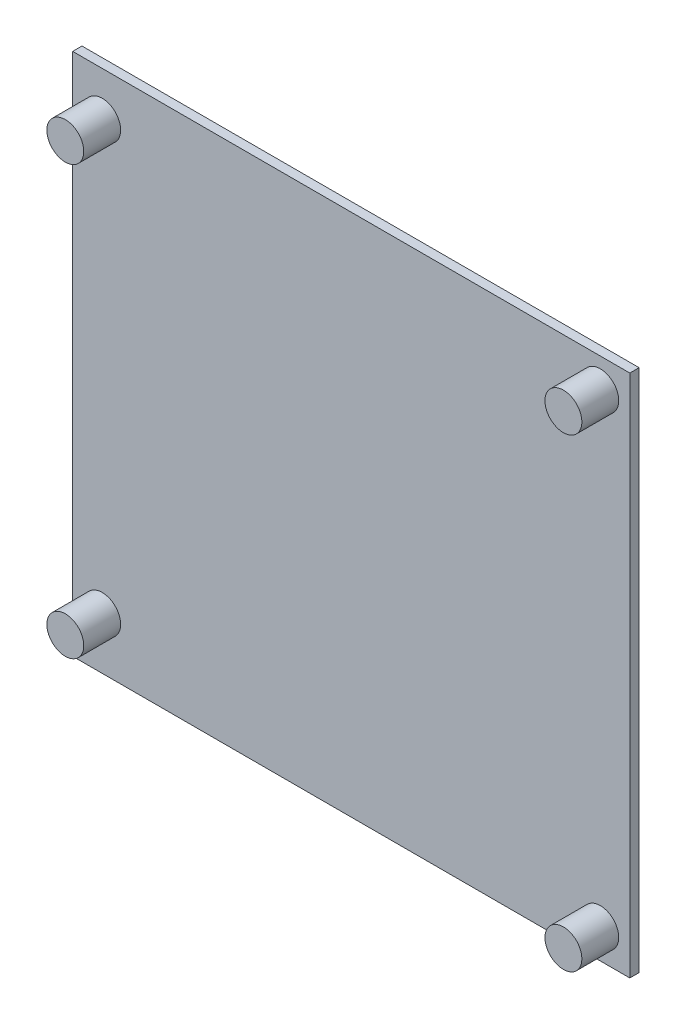
ISO-10303-21;
HEADER;
FILE_DESCRIPTION(('STEP AP214'),'2;1');
FILE_NAME('part.step','',(''),(''),'','','');
FILE_SCHEMA(('AUTOMOTIVE_DESIGN { 1 0 10303 214 1 1 1 1 }'));
ENDSEC;
DATA;
#1=APPLICATION_CONTEXT('core data for automotive mechanical design processes');
#2=APPLICATION_PROTOCOL_DEFINITION('international standard','automotive_design',2000,#1);
#3=PRODUCT_CONTEXT('',#1,'mechanical');
#4=PRODUCT('Part','Part','',(#3));
#5=PRODUCT_RELATED_PRODUCT_CATEGORY('part','',(#4));
#6=PRODUCT_DEFINITION_FORMATION('','',#4);
#7=PRODUCT_DEFINITION_CONTEXT('part definition',#1,'design');
#8=PRODUCT_DEFINITION('design','',#6,#7);
#9=PRODUCT_DEFINITION_SHAPE('','',#8);
#10=(LENGTH_UNIT() NAMED_UNIT(*) SI_UNIT(.MILLI.,.METRE.));
#11=(NAMED_UNIT(*) PLANE_ANGLE_UNIT() SI_UNIT($,.RADIAN.));
#12=(NAMED_UNIT(*) SI_UNIT($,.STERADIAN.) SOLID_ANGLE_UNIT());
#13=UNCERTAINTY_MEASURE_WITH_UNIT(LENGTH_MEASURE(1.E-05),#10,'distance_accuracy_value','');
#14=(GEOMETRIC_REPRESENTATION_CONTEXT(3) GLOBAL_UNCERTAINTY_ASSIGNED_CONTEXT((#13)) GLOBAL_UNIT_ASSIGNED_CONTEXT((#10,
#11,#12)) REPRESENTATION_CONTEXT('',''));
#15=CARTESIAN_POINT('',(0.,0.,0.));
#16=DIRECTION('',(0.,0.,1.));
#17=DIRECTION('',(1.,0.,0.));
#18=AXIS2_PLACEMENT_3D('',#15,#16,#17);
#19=CARTESIAN_POINT('',(0.,0.,1.6));
#20=DIRECTION('',(0.,0.,1.));
#21=DIRECTION('',(1.,0.,0.));
#22=AXIS2_PLACEMENT_3D('',#19,#20,#21);
#23=PLANE('',#22);
#24=CARTESIAN_POINT('',(-42.8625,37.465,1.6));
#25=DIRECTION('',(0.,0.,1.));
#26=DIRECTION('',(1.,0.,0.));
#27=AXIS2_PLACEMENT_3D('',#24,#25,#26);
#28=CIRCLE('',#27,3.175);
#29=CARTESIAN_POINT('',(-39.6875,37.465,1.6));
#30=VERTEX_POINT('',#29);
#31=EDGE_CURVE('E119',#30,#30,#28,.T.);
#32=ORIENTED_EDGE('',*,*,#31,.F.);
#33=EDGE_LOOP('',(#32));
#34=FACE_BOUND('',#33,.T.);
#35=CARTESIAN_POINT('',(42.8625,-40.005,1.6));
#36=DIRECTION('',(0.,0.,1.));
#37=DIRECTION('',(1.,0.,0.));
#38=AXIS2_PLACEMENT_3D('',#35,#36,#37);
#39=CIRCLE('',#38,3.175);
#40=CARTESIAN_POINT('',(46.0375,-40.005,1.6));
#41=VERTEX_POINT('',#40);
#42=EDGE_CURVE('E102',#41,#41,#39,.T.);
#43=ORIENTED_EDGE('',*,*,#42,.F.);
#44=EDGE_LOOP('',(#43));
#45=FACE_BOUND('',#44,.T.);
#46=DIRECTION('',(0.,1.,0.));
#47=VECTOR('',#46,1.);
#48=CARTESIAN_POINT('',(47.9425,45.085,1.6));
#49=LINE('',#48,#47);
#50=CARTESIAN_POINT('',(47.9425,-45.085,1.6));
#51=VERTEX_POINT('',#50);
#52=CARTESIAN_POINT('',(47.9425,45.085,1.6));
#53=VERTEX_POINT('',#52);
#54=EDGE_CURVE('E87',#51,#53,#49,.T.);
#55=ORIENTED_EDGE('',*,*,#54,.T.);
#56=DIRECTION('',(-1.,0.,0.));
#57=VECTOR('',#56,1.);
#58=CARTESIAN_POINT('',(-47.9425,45.085,1.6));
#59=LINE('',#58,#57);
#60=CARTESIAN_POINT('',(-47.9425,45.085,1.6));
#61=VERTEX_POINT('',#60);
#62=EDGE_CURVE('E82',#53,#61,#59,.T.);
#63=ORIENTED_EDGE('',*,*,#62,.T.);
#64=DIRECTION('',(0.,-1.,0.));
#65=VECTOR('',#64,1.);
#66=CARTESIAN_POINT('',(-47.9425,45.085,1.6));
#67=LINE('',#66,#65);
#68=CARTESIAN_POINT('',(-47.9425,-45.085,1.6));
#69=VERTEX_POINT('',#68);
#70=EDGE_CURVE('E85',#61,#69,#67,.T.);
#71=ORIENTED_EDGE('',*,*,#70,.T.);
#72=DIRECTION('',(1.,0.,0.));
#73=VECTOR('',#72,1.);
#74=CARTESIAN_POINT('',(-47.9425,-45.085,1.6));
#75=LINE('',#74,#73);
#76=EDGE_CURVE('E52',#69,#51,#75,.T.);
#77=ORIENTED_EDGE('',*,*,#76,.T.);
#78=EDGE_LOOP('',(#55,#63,#71,#77));
#79=FACE_BOUND('',#78,.T.);
#80=CARTESIAN_POINT('',(-42.8625,-36.195,1.6));
#81=DIRECTION('',(0.,0.,1.));
#82=DIRECTION('',(1.,0.,0.));
#83=AXIS2_PLACEMENT_3D('',#80,#81,#82);
#84=CIRCLE('',#83,3.175);
#85=CARTESIAN_POINT('',(-39.6875,-36.195,1.6));
#86=VERTEX_POINT('',#85);
#87=EDGE_CURVE('E116',#86,#86,#84,.T.);
#88=ORIENTED_EDGE('',*,*,#87,.F.);
#89=EDGE_LOOP('',(#88));
#90=FACE_BOUND('',#89,.T.);
#91=CARTESIAN_POINT('',(42.8625,40.005,1.6));
#92=DIRECTION('',(0.,0.,1.));
#93=DIRECTION('',(1.,0.,0.));
#94=AXIS2_PLACEMENT_3D('',#91,#92,#93);
#95=CIRCLE('',#94,3.175);
#96=CARTESIAN_POINT('',(46.0375,40.005,1.6));
#97=VERTEX_POINT('',#96);
#98=EDGE_CURVE('E122',#97,#97,#95,.T.);
#99=ORIENTED_EDGE('',*,*,#98,.F.);
#100=EDGE_LOOP('',(#99));
#101=FACE_BOUND('',#100,.T.);
#102=ADVANCED_FACE('F35',(#34,#45,#79,#90,#101),#23,.T.);
#103=CARTESIAN_POINT('',(0.,0.,0.));
#104=DIRECTION('',(0.,0.,1.));
#105=DIRECTION('',(1.,0.,0.));
#106=AXIS2_PLACEMENT_3D('',#103,#104,#105);
#107=PLANE('',#106);
#108=DIRECTION('',(0.,1.,0.));
#109=VECTOR('',#108,1.);
#110=CARTESIAN_POINT('',(47.9425,45.085,0.));
#111=LINE('',#110,#109);
#112=CARTESIAN_POINT('',(47.9425,-45.085,0.));
#113=VERTEX_POINT('',#112);
#114=CARTESIAN_POINT('',(47.9425,45.085,0.));
#115=VERTEX_POINT('',#114);
#116=EDGE_CURVE('E99',#113,#115,#111,.T.);
#117=ORIENTED_EDGE('',*,*,#116,.F.);
#118=DIRECTION('',(1.,0.,0.));
#119=VECTOR('',#118,1.);
#120=CARTESIAN_POINT('',(-47.9425,-45.085,0.));
#121=LINE('',#120,#119);
#122=CARTESIAN_POINT('',(-47.9425,-45.085,0.));
#123=VERTEX_POINT('',#122);
#124=EDGE_CURVE('E75',#123,#113,#121,.T.);
#125=ORIENTED_EDGE('',*,*,#124,.F.);
#126=DIRECTION('',(0.,-1.,0.));
#127=VECTOR('',#126,1.);
#128=CARTESIAN_POINT('',(-47.9425,45.085,0.));
#129=LINE('',#128,#127);
#130=CARTESIAN_POINT('',(-47.9425,45.085,0.));
#131=VERTEX_POINT('',#130);
#132=EDGE_CURVE('E69',#131,#123,#129,.T.);
#133=ORIENTED_EDGE('',*,*,#132,.F.);
#134=DIRECTION('',(-1.,0.,0.));
#135=VECTOR('',#134,1.);
#136=CARTESIAN_POINT('',(-47.9425,45.085,0.));
#137=LINE('',#136,#135);
#138=EDGE_CURVE('E91',#115,#131,#137,.T.);
#139=ORIENTED_EDGE('',*,*,#138,.F.);
#140=EDGE_LOOP('',(#117,#125,#133,#139));
#141=FACE_BOUND('',#140,.T.);
#142=CARTESIAN_POINT('',(42.8625,-40.005,0.));
#143=DIRECTION('',(0.,0.,1.));
#144=DIRECTION('',(1.,0.,0.));
#145=AXIS2_PLACEMENT_3D('',#142,#143,#144);
#146=CIRCLE('',#145,3.175);
#147=CARTESIAN_POINT('',(46.0375,-40.005,0.));
#148=VERTEX_POINT('',#147);
#149=EDGE_CURVE('E143',#148,#148,#146,.T.);
#150=ORIENTED_EDGE('',*,*,#149,.T.);
#151=EDGE_LOOP('',(#150));
#152=FACE_BOUND('',#151,.T.);
#153=CARTESIAN_POINT('',(-42.8625,-36.195,0.));
#154=DIRECTION('',(0.,0.,1.));
#155=DIRECTION('',(1.,0.,0.));
#156=AXIS2_PLACEMENT_3D('',#153,#154,#155);
#157=CIRCLE('',#156,3.175);
#158=CARTESIAN_POINT('',(-39.6875,-36.195,0.));
#159=VERTEX_POINT('',#158);
#160=EDGE_CURVE('E134',#159,#159,#157,.T.);
#161=ORIENTED_EDGE('',*,*,#160,.T.);
#162=EDGE_LOOP('',(#161));
#163=FACE_BOUND('',#162,.T.);
#164=CARTESIAN_POINT('',(-42.8625,37.465,0.));
#165=DIRECTION('',(0.,0.,1.));
#166=DIRECTION('',(1.,0.,0.));
#167=AXIS2_PLACEMENT_3D('',#164,#165,#166);
#168=CIRCLE('',#167,3.175);
#169=CARTESIAN_POINT('',(-39.6875,37.465,0.));
#170=VERTEX_POINT('',#169);
#171=EDGE_CURVE('E152',#170,#170,#168,.T.);
#172=ORIENTED_EDGE('',*,*,#171,.T.);
#173=EDGE_LOOP('',(#172));
#174=FACE_BOUND('',#173,.T.);
#175=CARTESIAN_POINT('',(42.8625,40.005,0.));
#176=DIRECTION('',(0.,0.,1.));
#177=DIRECTION('',(1.,0.,0.));
#178=AXIS2_PLACEMENT_3D('',#175,#176,#177);
#179=CIRCLE('',#178,3.175);
#180=CARTESIAN_POINT('',(46.0375,40.005,0.));
#181=VERTEX_POINT('',#180);
#182=EDGE_CURVE('E125',#181,#181,#179,.T.);
#183=ORIENTED_EDGE('',*,*,#182,.T.);
#184=EDGE_LOOP('',(#183));
#185=FACE_BOUND('',#184,.T.);
#186=ADVANCED_FACE('F110',(#141,#152,#163,#174,#185),#107,.F.);
#187=CARTESIAN_POINT('',(47.9425,45.085,1.6));
#188=DIRECTION('',(-1.,0.,0.));
#189=DIRECTION('',(0.,-1.,0.));
#190=AXIS2_PLACEMENT_3D('',#187,#188,#189);
#191=PLANE('',#190);
#192=ORIENTED_EDGE('',*,*,#116,.T.);
#193=DIRECTION('',(0.,0.,-1.));
#194=VECTOR('',#193,1.);
#195=CARTESIAN_POINT('',(47.9425,45.085,1.6));
#196=LINE('',#195,#194);
#197=EDGE_CURVE('E11',#53,#115,#196,.T.);
#198=ORIENTED_EDGE('',*,*,#197,.F.);
#199=ORIENTED_EDGE('',*,*,#54,.F.);
#200=DIRECTION('',(0.,0.,-1.));
#201=VECTOR('',#200,1.);
#202=CARTESIAN_POINT('',(47.9425,-45.085,1.6));
#203=LINE('',#202,#201);
#204=EDGE_CURVE('E95',#51,#113,#203,.T.);
#205=ORIENTED_EDGE('',*,*,#204,.T.);
#206=EDGE_LOOP('',(#192,#198,#199,#205));
#207=FACE_BOUND('',#206,.T.);
#208=ADVANCED_FACE('F37',(#207),#191,.F.);
#209=CARTESIAN_POINT('',(-47.9425,45.085,1.6));
#210=DIRECTION('',(0.,-1.,0.));
#211=DIRECTION('',(0.,0.,-1.));
#212=AXIS2_PLACEMENT_3D('',#209,#210,#211);
#213=PLANE('',#212);
#214=ORIENTED_EDGE('',*,*,#138,.T.);
#215=DIRECTION('',(0.,0.,-1.));
#216=VECTOR('',#215,1.);
#217=CARTESIAN_POINT('',(-47.9425,45.085,1.6));
#218=LINE('',#217,#216);
#219=EDGE_CURVE('E44',#61,#131,#218,.T.);
#220=ORIENTED_EDGE('',*,*,#219,.F.);
#221=ORIENTED_EDGE('',*,*,#62,.F.);
#222=ORIENTED_EDGE('',*,*,#197,.T.);
#223=EDGE_LOOP('',(#214,#220,#221,#222));
#224=FACE_BOUND('',#223,.T.);
#225=ADVANCED_FACE('F90',(#224),#213,.F.);
#226=CARTESIAN_POINT('',(-47.9425,45.085,1.6));
#227=DIRECTION('',(1.,0.,0.));
#228=DIRECTION('',(0.,1.,0.));
#229=AXIS2_PLACEMENT_3D('',#226,#227,#228);
#230=PLANE('',#229);
#231=ORIENTED_EDGE('',*,*,#132,.T.);
#232=DIRECTION('',(0.,0.,-1.));
#233=VECTOR('',#232,1.);
#234=CARTESIAN_POINT('',(-47.9425,-45.085,1.6));
#235=LINE('',#234,#233);
#236=EDGE_CURVE('E92',#69,#123,#235,.T.);
#237=ORIENTED_EDGE('',*,*,#236,.F.);
#238=ORIENTED_EDGE('',*,*,#70,.F.);
#239=ORIENTED_EDGE('',*,*,#219,.T.);
#240=EDGE_LOOP('',(#231,#237,#238,#239));
#241=FACE_BOUND('',#240,.T.);
#242=ADVANCED_FACE('F93',(#241),#230,.F.);
#243=CARTESIAN_POINT('',(-47.9425,-45.085,1.6));
#244=DIRECTION('',(0.,1.,0.));
#245=DIRECTION('',(0.,0.,1.));
#246=AXIS2_PLACEMENT_3D('',#243,#244,#245);
#247=PLANE('',#246);
#248=ORIENTED_EDGE('',*,*,#124,.T.);
#249=ORIENTED_EDGE('',*,*,#204,.F.);
#250=ORIENTED_EDGE('',*,*,#76,.F.);
#251=ORIENTED_EDGE('',*,*,#236,.T.);
#252=EDGE_LOOP('',(#248,#249,#250,#251));
#253=FACE_BOUND('',#252,.T.);
#254=ADVANCED_FACE('F107',(#253),#247,.F.);
#255=CARTESIAN_POINT('',(0.,0.,-0.4));
#256=DIRECTION('',(0.,0.,1.));
#257=DIRECTION('',(1.,0.,0.));
#258=AXIS2_PLACEMENT_3D('',#255,#256,#257);
#259=PLANE('',#258);
#260=CARTESIAN_POINT('',(42.8625,40.005,-0.4));
#261=DIRECTION('',(0.,0.,1.));
#262=DIRECTION('',(1.,0.,0.));
#263=AXIS2_PLACEMENT_3D('',#260,#261,#262);
#264=CIRCLE('',#263,3.175);
#265=CARTESIAN_POINT('',(46.0375,40.005,-0.4));
#266=VERTEX_POINT('',#265);
#267=EDGE_CURVE('E128',#266,#266,#264,.T.);
#268=ORIENTED_EDGE('',*,*,#267,.F.);
#269=EDGE_LOOP('',(#268));
#270=FACE_BOUND('',#269,.T.);
#271=ADVANCED_FACE('F194',(#270),#259,.F.);
#272=CARTESIAN_POINT('',(42.8625,40.005,-0.4));
#273=DIRECTION('',(0.,0.,1.));
#274=DIRECTION('',(1.,0.,0.));
#275=AXIS2_PLACEMENT_3D('',#272,#273,#274);
#276=CYLINDRICAL_SURFACE('',#275,3.175);
#277=ORIENTED_EDGE('',*,*,#267,.T.);
#278=EDGE_LOOP('',(#277));
#279=FACE_BOUND('',#278,.T.);
#280=ORIENTED_EDGE('',*,*,#182,.F.);
#281=EDGE_LOOP('',(#280));
#282=FACE_BOUND('',#281,.T.);
#283=ADVANCED_FACE('F236',(#279,#282),#276,.T.);
#284=ORIENTED_EDGE('',*,*,#98,.T.);
#285=EDGE_LOOP('',(#284));
#286=FACE_BOUND('',#285,.T.);
#287=CARTESIAN_POINT('',(42.8625,40.005,7.95));
#288=DIRECTION('',(0.,0.,1.));
#289=DIRECTION('',(1.,0.,0.));
#290=AXIS2_PLACEMENT_3D('',#287,#288,#289);
#291=CIRCLE('',#290,3.175);
#292=CARTESIAN_POINT('',(46.0375,40.005,7.95));
#293=VERTEX_POINT('',#292);
#294=EDGE_CURVE('E131',#293,#293,#291,.T.);
#295=ORIENTED_EDGE('',*,*,#294,.F.);
#296=EDGE_LOOP('',(#295));
#297=FACE_BOUND('',#296,.T.);
#298=ADVANCED_FACE('F189',(#286,#297),#276,.T.);
#299=CARTESIAN_POINT('',(0.,0.,7.95));
#300=DIRECTION('',(0.,0.,1.));
#301=DIRECTION('',(1.,0.,0.));
#302=AXIS2_PLACEMENT_3D('',#299,#300,#301);
#303=PLANE('',#302);
#304=ORIENTED_EDGE('',*,*,#294,.T.);
#305=EDGE_LOOP('',(#304));
#306=FACE_BOUND('',#305,.T.);
#307=ADVANCED_FACE('F251',(#306),#303,.T.);
#308=CARTESIAN_POINT('',(0.,0.,-0.4));
#309=DIRECTION('',(0.,0.,1.));
#310=DIRECTION('',(1.,0.,0.));
#311=AXIS2_PLACEMENT_3D('',#308,#309,#310);
#312=PLANE('',#311);
#313=CARTESIAN_POINT('',(-42.8625,-36.195,-0.4));
#314=DIRECTION('',(0.,0.,1.));
#315=DIRECTION('',(1.,0.,0.));
#316=AXIS2_PLACEMENT_3D('',#313,#314,#315);
#317=CIRCLE('',#316,3.175);
#318=CARTESIAN_POINT('',(-39.6875,-36.195,-0.4));
#319=VERTEX_POINT('',#318);
#320=EDGE_CURVE('E140',#319,#319,#317,.T.);
#321=ORIENTED_EDGE('',*,*,#320,.F.);
#322=EDGE_LOOP('',(#321));
#323=FACE_BOUND('',#322,.T.);
#324=ADVANCED_FACE('F259',(#323),#312,.F.);
#325=CARTESIAN_POINT('',(-42.8625,-36.195,-0.4));
#326=DIRECTION('',(0.,0.,1.));
#327=DIRECTION('',(1.,0.,0.));
#328=AXIS2_PLACEMENT_3D('',#325,#326,#327);
#329=CYLINDRICAL_SURFACE('',#328,3.175);
#330=ORIENTED_EDGE('',*,*,#320,.T.);
#331=EDGE_LOOP('',(#330));
#332=FACE_BOUND('',#331,.T.);
#333=ORIENTED_EDGE('',*,*,#160,.F.);
#334=EDGE_LOOP('',(#333));
#335=FACE_BOUND('',#334,.T.);
#336=ADVANCED_FACE('F268',(#332,#335),#329,.T.);
#337=ORIENTED_EDGE('',*,*,#87,.T.);
#338=EDGE_LOOP('',(#337));
#339=FACE_BOUND('',#338,.T.);
#340=CARTESIAN_POINT('',(-42.8625,-36.195,7.95));
#341=DIRECTION('',(0.,0.,1.));
#342=DIRECTION('',(1.,0.,0.));
#343=AXIS2_PLACEMENT_3D('',#340,#341,#342);
#344=CIRCLE('',#343,3.175);
#345=CARTESIAN_POINT('',(-39.6875,-36.195,7.95));
#346=VERTEX_POINT('',#345);
#347=EDGE_CURVE('E137',#346,#346,#344,.T.);
#348=ORIENTED_EDGE('',*,*,#347,.F.);
#349=EDGE_LOOP('',(#348));
#350=FACE_BOUND('',#349,.T.);
#351=ADVANCED_FACE('F277',(#339,#350),#329,.T.);
#352=CARTESIAN_POINT('',(0.,0.,7.95));
#353=DIRECTION('',(0.,0.,1.));
#354=DIRECTION('',(1.,0.,0.));
#355=AXIS2_PLACEMENT_3D('',#352,#353,#354);
#356=PLANE('',#355);
#357=ORIENTED_EDGE('',*,*,#347,.T.);
#358=EDGE_LOOP('',(#357));
#359=FACE_BOUND('',#358,.T.);
#360=ADVANCED_FACE('F286',(#359),#356,.T.);
#361=CARTESIAN_POINT('',(0.,0.,-0.4));
#362=DIRECTION('',(0.,0.,1.));
#363=DIRECTION('',(1.,0.,0.));
#364=AXIS2_PLACEMENT_3D('',#361,#362,#363);
#365=PLANE('',#364);
#366=CARTESIAN_POINT('',(42.8625,-40.005,-0.4));
#367=DIRECTION('',(0.,0.,1.));
#368=DIRECTION('',(1.,0.,0.));
#369=AXIS2_PLACEMENT_3D('',#366,#367,#368);
#370=CIRCLE('',#369,3.175);
#371=CARTESIAN_POINT('',(46.0375,-40.005,-0.4));
#372=VERTEX_POINT('',#371);
#373=EDGE_CURVE('E149',#372,#372,#370,.T.);
#374=ORIENTED_EDGE('',*,*,#373,.F.);
#375=EDGE_LOOP('',(#374));
#376=FACE_BOUND('',#375,.T.);
#377=ADVANCED_FACE('F294',(#376),#365,.F.);
#378=CARTESIAN_POINT('',(42.8625,-40.005,-0.4));
#379=DIRECTION('',(0.,0.,1.));
#380=DIRECTION('',(1.,0.,0.));
#381=AXIS2_PLACEMENT_3D('',#378,#379,#380);
#382=CYLINDRICAL_SURFACE('',#381,3.175);
#383=ORIENTED_EDGE('',*,*,#373,.T.);
#384=EDGE_LOOP('',(#383));
#385=FACE_BOUND('',#384,.T.);
#386=ORIENTED_EDGE('',*,*,#149,.F.);
#387=EDGE_LOOP('',(#386));
#388=FACE_BOUND('',#387,.T.);
#389=ADVANCED_FACE('F303',(#385,#388),#382,.T.);
#390=ORIENTED_EDGE('',*,*,#42,.T.);
#391=EDGE_LOOP('',(#390));
#392=FACE_BOUND('',#391,.T.);
#393=CARTESIAN_POINT('',(42.8625,-40.005,7.95));
#394=DIRECTION('',(0.,0.,1.));
#395=DIRECTION('',(1.,0.,0.));
#396=AXIS2_PLACEMENT_3D('',#393,#394,#395);
#397=CIRCLE('',#396,3.175);
#398=CARTESIAN_POINT('',(46.0375,-40.005,7.95));
#399=VERTEX_POINT('',#398);
#400=EDGE_CURVE('E146',#399,#399,#397,.T.);
#401=ORIENTED_EDGE('',*,*,#400,.F.);
#402=EDGE_LOOP('',(#401));
#403=FACE_BOUND('',#402,.T.);
#404=ADVANCED_FACE('F175',(#392,#403),#382,.T.);
#405=CARTESIAN_POINT('',(0.,0.,7.95));
#406=DIRECTION('',(0.,0.,1.));
#407=DIRECTION('',(1.,0.,0.));
#408=AXIS2_PLACEMENT_3D('',#405,#406,#407);
#409=PLANE('',#408);
#410=ORIENTED_EDGE('',*,*,#400,.T.);
#411=EDGE_LOOP('',(#410));
#412=FACE_BOUND('',#411,.T.);
#413=ADVANCED_FACE('F167',(#412),#409,.T.);
#414=CARTESIAN_POINT('',(-42.8625,37.465,-0.4));
#415=DIRECTION('',(0.,0.,1.));
#416=DIRECTION('',(1.,0.,0.));
#417=AXIS2_PLACEMENT_3D('',#414,#415,#416);
#418=PLANE('',#417);
#419=CARTESIAN_POINT('',(-42.8625,37.465,-0.4));
#420=DIRECTION('',(0.,0.,1.));
#421=DIRECTION('',(1.,0.,0.));
#422=AXIS2_PLACEMENT_3D('',#419,#420,#421);
#423=CIRCLE('',#422,3.175);
#424=CARTESIAN_POINT('',(-39.6875,37.465,-0.4));
#425=VERTEX_POINT('',#424);
#426=EDGE_CURVE('E158',#425,#425,#423,.T.);
#427=ORIENTED_EDGE('',*,*,#426,.F.);
#428=EDGE_LOOP('',(#427));
#429=FACE_BOUND('',#428,.T.);
#430=ADVANCED_FACE('F165',(#429),#418,.F.);
#431=CARTESIAN_POINT('',(-42.8625,37.465,-0.4));
#432=DIRECTION('',(0.,0.,1.));
#433=DIRECTION('',(1.,0.,0.));
#434=AXIS2_PLACEMENT_3D('',#431,#432,#433);
#435=CYLINDRICAL_SURFACE('',#434,3.175);
#436=ORIENTED_EDGE('',*,*,#426,.T.);
#437=EDGE_LOOP('',(#436));
#438=FACE_BOUND('',#437,.T.);
#439=ORIENTED_EDGE('',*,*,#171,.F.);
#440=EDGE_LOOP('',(#439));
#441=FACE_BOUND('',#440,.T.);
#442=ADVANCED_FACE('F162',(#438,#441),#435,.T.);
#443=ORIENTED_EDGE('',*,*,#31,.T.);
#444=EDGE_LOOP('',(#443));
#445=FACE_BOUND('',#444,.T.);
#446=CARTESIAN_POINT('',(-42.8625,37.465,7.95));
#447=DIRECTION('',(0.,0.,1.));
#448=DIRECTION('',(1.,0.,0.));
#449=AXIS2_PLACEMENT_3D('',#446,#447,#448);
#450=CIRCLE('',#449,3.175);
#451=CARTESIAN_POINT('',(-39.6875,37.465,7.95));
#452=VERTEX_POINT('',#451);
#453=EDGE_CURVE('E155',#452,#452,#450,.T.);
#454=ORIENTED_EDGE('',*,*,#453,.F.);
#455=EDGE_LOOP('',(#454));
#456=FACE_BOUND('',#455,.T.);
#457=ADVANCED_FACE('F173',(#445,#456),#435,.T.);
#458=CARTESIAN_POINT('',(-42.8625,37.465,7.95));
#459=DIRECTION('',(0.,0.,1.));
#460=DIRECTION('',(1.,0.,0.));
#461=AXIS2_PLACEMENT_3D('',#458,#459,#460);
#462=PLANE('',#461);
#463=ORIENTED_EDGE('',*,*,#453,.T.);
#464=EDGE_LOOP('',(#463));
#465=FACE_BOUND('',#464,.T.);
#466=ADVANCED_FACE('F341',(#465),#462,.T.);
#467=CLOSED_SHELL('',(#102,#186,#208,#225,#242,#254,#271,#283,#298,#307,#324,#336,#351,#360,
#377,#389,#404,#413,#430,#442,#457,#466));
#468=MANIFOLD_SOLID_BREP('B2',#467);
#469=ADVANCED_BREP_SHAPE_REPRESENTATION('',(#18,#468),#14);
#470=SHAPE_DEFINITION_REPRESENTATION(#9,#469);
ENDSEC;
END-ISO-10303-21;
